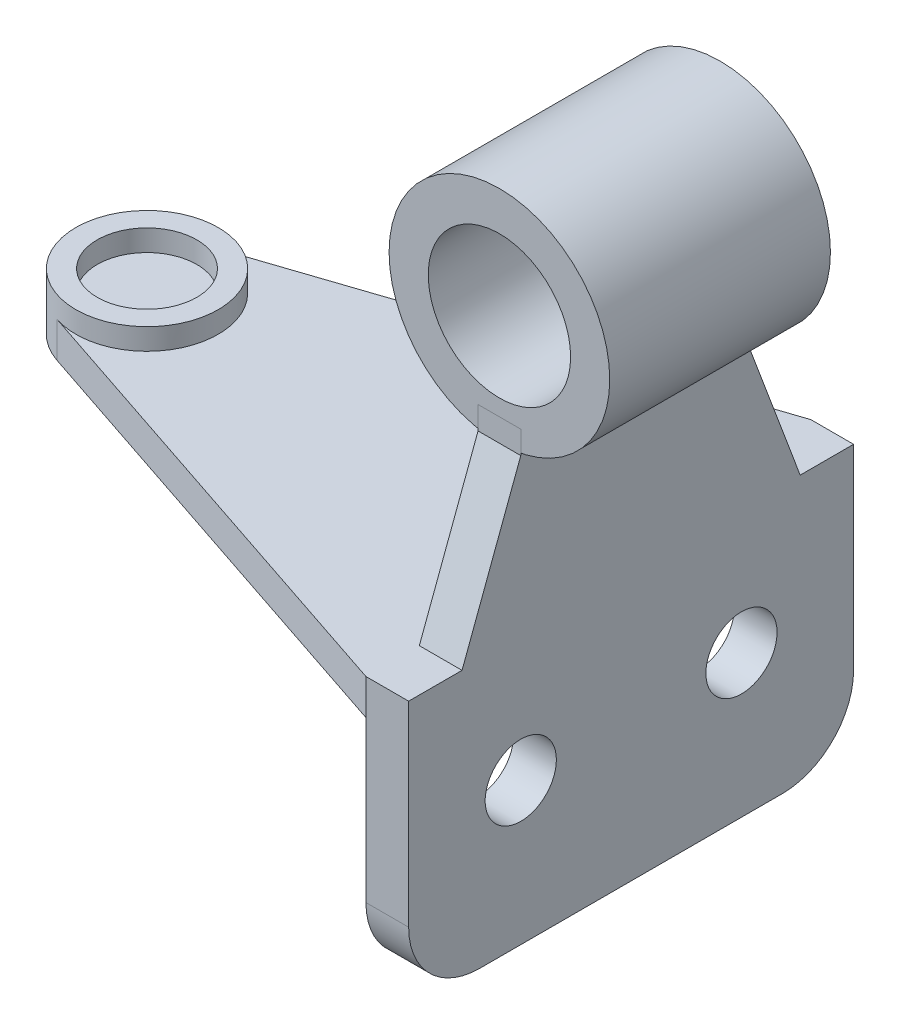
ISO-10303-21;
HEADER;
FILE_DESCRIPTION(('STEP AP214'),'2;1');
FILE_NAME('part.step','',(''),(''),'','','');
FILE_SCHEMA(('AUTOMOTIVE_DESIGN { 1 0 10303 214 1 1 1 1 }'));
ENDSEC;
DATA;
#1=APPLICATION_CONTEXT('core data for automotive mechanical design processes');
#2=APPLICATION_PROTOCOL_DEFINITION('international standard','automotive_design',2000,#1);
#3=PRODUCT_CONTEXT('',#1,'mechanical');
#4=PRODUCT('Part','Part','',(#3));
#5=PRODUCT_RELATED_PRODUCT_CATEGORY('part','',(#4));
#6=PRODUCT_DEFINITION_FORMATION('','',#4);
#7=PRODUCT_DEFINITION_CONTEXT('part definition',#1,'design');
#8=PRODUCT_DEFINITION('design','',#6,#7);
#9=PRODUCT_DEFINITION_SHAPE('','',#8);
#10=(LENGTH_UNIT() NAMED_UNIT(*) SI_UNIT(.MILLI.,.METRE.));
#11=(NAMED_UNIT(*) PLANE_ANGLE_UNIT() SI_UNIT($,.RADIAN.));
#12=(NAMED_UNIT(*) SI_UNIT($,.STERADIAN.) SOLID_ANGLE_UNIT());
#13=UNCERTAINTY_MEASURE_WITH_UNIT(LENGTH_MEASURE(1.E-05),#10,'distance_accuracy_value','');
#14=(GEOMETRIC_REPRESENTATION_CONTEXT(3) GLOBAL_UNCERTAINTY_ASSIGNED_CONTEXT((#13)) GLOBAL_UNIT_ASSIGNED_CONTEXT((#10,
#11,#12)) REPRESENTATION_CONTEXT('',''));
#15=CARTESIAN_POINT('',(0.,0.,0.));
#16=DIRECTION('',(0.,0.,1.));
#17=DIRECTION('',(1.,0.,0.));
#18=AXIS2_PLACEMENT_3D('',#15,#16,#17);
#19=CARTESIAN_POINT('',(-6.00000000000001,85.,-31.));
#20=DIRECTION('',(0.,0.,1.));
#21=DIRECTION('',(1.,0.,0.));
#22=AXIS2_PLACEMENT_3D('',#19,#20,#21);
#23=CYLINDRICAL_SURFACE('',#22,31.);
#24=CARTESIAN_POINT('',(-6.00000000000001,85.,-31.));
#25=DIRECTION('',(0.,0.,1.));
#26=DIRECTION('',(1.,0.,0.));
#27=AXIS2_PLACEMENT_3D('',#24,#25,#26);
#28=CIRCLE('',#27,31.);
#29=CARTESIAN_POINT('',(25.,85.,-31.));
#30=VERTEX_POINT('',#29);
#31=EDGE_CURVE('E11',#30,#30,#28,.T.);
#32=ORIENTED_EDGE('',*,*,#31,.T.);
#33=EDGE_LOOP('',(#32));
#34=FACE_BOUND('',#33,.T.);
#35=CARTESIAN_POINT('',(-6.00000000000001,85.,31.));
#36=DIRECTION('',(0.,0.,1.));
#37=DIRECTION('',(1.,0.,0.));
#38=AXIS2_PLACEMENT_3D('',#35,#36,#37);
#39=CIRCLE('',#38,31.);
#40=CARTESIAN_POINT('',(25.,85.,31.));
#41=VERTEX_POINT('',#40);
#42=EDGE_CURVE('E55',#41,#41,#39,.T.);
#43=ORIENTED_EDGE('',*,*,#42,.F.);
#44=EDGE_LOOP('',(#43));
#45=FACE_BOUND('',#44,.T.);
#46=ADVANCED_FACE('F45',(#34,#45),#23,.T.);
#47=CARTESIAN_POINT('',(-6.00000000000001,85.,-31.));
#48=DIRECTION('',(0.,0.,1.));
#49=DIRECTION('',(1.,0.,0.));
#50=AXIS2_PLACEMENT_3D('',#47,#48,#49);
#51=PLANE('',#50);
#52=CARTESIAN_POINT('',(-6.00000000000001,85.,-31.));
#53=DIRECTION('',(0.,0.,1.));
#54=DIRECTION('',(1.,0.,0.));
#55=AXIS2_PLACEMENT_3D('',#52,#53,#54);
#56=CIRCLE('',#55,20.);
#57=CARTESIAN_POINT('',(14.,85.,-31.));
#58=VERTEX_POINT('',#57);
#59=EDGE_CURVE('E51',#58,#58,#56,.T.);
#60=ORIENTED_EDGE('',*,*,#59,.T.);
#61=EDGE_LOOP('',(#60));
#62=FACE_BOUND('',#61,.T.);
#63=ORIENTED_EDGE('',*,*,#31,.F.);
#64=EDGE_LOOP('',(#63));
#65=FACE_BOUND('',#64,.T.);
#66=ADVANCED_FACE('F74',(#62,#65),#51,.F.);
#67=CARTESIAN_POINT('',(-6.00000000000001,85.,-31.));
#68=DIRECTION('',(0.,0.,1.));
#69=DIRECTION('',(1.,0.,0.));
#70=AXIS2_PLACEMENT_3D('',#67,#68,#69);
#71=CYLINDRICAL_SURFACE('',#70,20.);
#72=ORIENTED_EDGE('',*,*,#59,.F.);
#73=EDGE_LOOP('',(#72));
#74=FACE_BOUND('',#73,.T.);
#75=CARTESIAN_POINT('',(-6.00000000000001,85.,31.));
#76=DIRECTION('',(0.,0.,1.));
#77=DIRECTION('',(1.,0.,0.));
#78=AXIS2_PLACEMENT_3D('',#75,#76,#77);
#79=CIRCLE('',#78,20.);
#80=CARTESIAN_POINT('',(14.,85.,31.));
#81=VERTEX_POINT('',#80);
#82=EDGE_CURVE('E59',#81,#81,#79,.T.);
#83=ORIENTED_EDGE('',*,*,#82,.T.);
#84=EDGE_LOOP('',(#83));
#85=FACE_BOUND('',#84,.T.);
#86=ADVANCED_FACE('F65',(#74,#85),#71,.F.);
#87=CARTESIAN_POINT('',(-6.00000000000001,85.,31.));
#88=DIRECTION('',(0.,0.,1.));
#89=DIRECTION('',(1.,0.,0.));
#90=AXIS2_PLACEMENT_3D('',#87,#88,#89);
#91=PLANE('',#90);
#92=ORIENTED_EDGE('',*,*,#42,.T.);
#93=EDGE_LOOP('',(#92));
#94=FACE_BOUND('',#93,.T.);
#95=ORIENTED_EDGE('',*,*,#82,.F.);
#96=EDGE_LOOP('',(#95));
#97=FACE_BOUND('',#96,.T.);
#98=ADVANCED_FACE('F67',(#94,#97),#91,.T.);
#99=CLOSED_SHELL('',(#46,#66,#86,#98));
#100=MANIFOLD_SOLID_BREP('B2',#99);
#101=CARTESIAN_POINT('',(0.,10.,0.));
#102=DIRECTION('',(-1.,0.,0.));
#103=DIRECTION('',(0.,0.,1.));
#104=AXIS2_PLACEMENT_3D('',#101,#102,#103);
#105=PLANE('',#104);
#106=CARTESIAN_POINT('',(0.,-25.,31.));
#107=DIRECTION('',(1.,0.,0.));
#108=DIRECTION('',(0.,0.,-1.));
#109=AXIS2_PLACEMENT_3D('',#106,#107,#108);
#110=CIRCLE('',#109,10.);
#111=CARTESIAN_POINT('',(0.,-25.,21.));
#112=VERTEX_POINT('',#111);
#113=EDGE_CURVE('E414',#112,#112,#110,.T.);
#114=ORIENTED_EDGE('',*,*,#113,.F.);
#115=EDGE_LOOP('',(#114));
#116=FACE_BOUND('',#115,.T.);
#117=CARTESIAN_POINT('',(0.,-25.,-31.));
#118=DIRECTION('',(1.,0.,0.));
#119=DIRECTION('',(0.,0.,-1.));
#120=AXIS2_PLACEMENT_3D('',#117,#118,#119);
#121=CIRCLE('',#120,10.);
#122=CARTESIAN_POINT('',(0.,-25.,-41.));
#123=VERTEX_POINT('',#122);
#124=EDGE_CURVE('E247',#123,#123,#121,.T.);
#125=ORIENTED_EDGE('',*,*,#124,.F.);
#126=EDGE_LOOP('',(#125));
#127=FACE_BOUND('',#126,.T.);
#128=DIRECTION('',(0.,-1.,0.));
#129=VECTOR('',#128,1.);
#130=CARTESIAN_POINT('',(0.,10.,62.5000000001097));
#131=LINE('',#130,#129);
#132=CARTESIAN_POINT('',(0.,10.,62.5000000001097));
#133=VERTEX_POINT('',#132);
#134=CARTESIAN_POINT('',(0.,-45.,62.5000000001097));
#135=VERTEX_POINT('',#134);
#136=EDGE_CURVE('E331',#133,#135,#131,.T.);
#137=ORIENTED_EDGE('',*,*,#136,.T.);
#138=CARTESIAN_POINT('',(0.,-45.,42.5000000001096));
#139=DIRECTION('',(1.,0.,0.));
#140=DIRECTION('',(0.,0.,-1.));
#141=AXIS2_PLACEMENT_3D('',#138,#139,#140);
#142=CIRCLE('',#141,20.);
#143=CARTESIAN_POINT('',(0.,-65.,42.5000000001096));
#144=VERTEX_POINT('',#143);
#145=EDGE_CURVE('E219',#135,#144,#142,.T.);
#146=ORIENTED_EDGE('',*,*,#145,.T.);
#147=DIRECTION('',(0.,0.,-1.));
#148=VECTOR('',#147,1.);
#149=CARTESIAN_POINT('',(0.,-65.,-42.5000000001096));
#150=LINE('',#149,#148);
#151=CARTESIAN_POINT('',(0.,-65.,-42.5000000001096));
#152=VERTEX_POINT('',#151);
#153=EDGE_CURVE('E244',#144,#152,#150,.T.);
#154=ORIENTED_EDGE('',*,*,#153,.T.);
#155=CARTESIAN_POINT('',(0.,-45.,-42.5000000001096));
#156=DIRECTION('',(1.,0.,0.));
#157=DIRECTION('',(0.,0.,-1.));
#158=AXIS2_PLACEMENT_3D('',#155,#156,#157);
#159=CIRCLE('',#158,20.);
#160=CARTESIAN_POINT('',(0.,-45.,-62.5000000001096));
#161=VERTEX_POINT('',#160);
#162=EDGE_CURVE('E241',#152,#161,#159,.T.);
#163=ORIENTED_EDGE('',*,*,#162,.T.);
#164=DIRECTION('',(0.,-1.,0.));
#165=VECTOR('',#164,1.);
#166=CARTESIAN_POINT('',(0.,10.,-62.5000000001096));
#167=LINE('',#166,#165);
#168=CARTESIAN_POINT('',(0.,10.,-62.5000000001096));
#169=VERTEX_POINT('',#168);
#170=EDGE_CURVE('E110',#169,#161,#167,.T.);
#171=ORIENTED_EDGE('',*,*,#170,.F.);
#172=DIRECTION('',(0.,0.,-1.));
#173=VECTOR('',#172,1.);
#174=CARTESIAN_POINT('',(0.,10.,0.));
#175=LINE('',#174,#173);
#176=CARTESIAN_POINT('',(0.,10.,-47.5));
#177=VERTEX_POINT('',#176);
#178=EDGE_CURVE('E322',#177,#169,#175,.T.);
#179=ORIENTED_EDGE('',*,*,#178,.F.);
#180=DIRECTION('',(0.,0.936329177569045,0.351123441588392));
#181=VECTOR('',#180,1.);
#182=CARTESIAN_POINT('',(0.,54.,-31.));
#183=LINE('',#182,#181);
#184=CARTESIAN_POINT('',(0.,54.,-31.));
#185=VERTEX_POINT('',#184);
#186=EDGE_CURVE('E264',#177,#185,#183,.T.);
#187=ORIENTED_EDGE('',*,*,#186,.T.);
#188=DIRECTION('',(0.,1.,0.));
#189=VECTOR('',#188,1.);
#190=CARTESIAN_POINT('',(0.,54.,-31.));
#191=LINE('',#190,#189);
#192=CARTESIAN_POINT('',(0.,60.4310129353531,-31.));
#193=VERTEX_POINT('',#192);
#194=EDGE_CURVE('E288',#185,#193,#191,.T.);
#195=ORIENTED_EDGE('',*,*,#194,.T.);
#196=DIRECTION('',(0.,0.,1.));
#197=VECTOR('',#196,1.);
#198=CARTESIAN_POINT('',(0.,60.4310129353531,-31.));
#199=LINE('',#198,#197);
#200=CARTESIAN_POINT('',(0.,60.4310129353531,31.));
#201=VERTEX_POINT('',#200);
#202=EDGE_CURVE('E291',#193,#201,#199,.T.);
#203=ORIENTED_EDGE('',*,*,#202,.T.);
#204=DIRECTION('',(0.,-1.,0.));
#205=VECTOR('',#204,1.);
#206=CARTESIAN_POINT('',(0.,54.,31.));
#207=LINE('',#206,#205);
#208=CARTESIAN_POINT('',(0.,54.,31.));
#209=VERTEX_POINT('',#208);
#210=EDGE_CURVE('E294',#201,#209,#207,.T.);
#211=ORIENTED_EDGE('',*,*,#210,.T.);
#212=DIRECTION('',(0.,-0.936329177569045,0.351123441588392));
#213=VECTOR('',#212,1.);
#214=CARTESIAN_POINT('',(0.,10.,47.5));
#215=LINE('',#214,#213);
#216=CARTESIAN_POINT('',(0.,10.,47.5));
#217=VERTEX_POINT('',#216);
#218=EDGE_CURVE('E270',#209,#217,#215,.T.);
#219=ORIENTED_EDGE('',*,*,#218,.T.);
#220=EDGE_CURVE('E319',#133,#217,#175,.T.);
#221=ORIENTED_EDGE('',*,*,#220,.F.);
#222=EDGE_LOOP('',(#137,#146,#154,#163,#171,#179,#187,#195,#203,#211,#219,#221));
#223=FACE_BOUND('',#222,.T.);
#224=ADVANCED_FACE('F107',(#116,#127,#223),#105,.F.);
#225=CARTESIAN_POINT('',(0.,10.,-62.5000000001096));
#226=DIRECTION('',(0.,0.,1.));
#227=DIRECTION('',(1.,0.,0.));
#228=AXIS2_PLACEMENT_3D('',#225,#226,#227);
#229=PLANE('',#228);
#230=ORIENTED_EDGE('',*,*,#170,.T.);
#231=DIRECTION('',(1.,0.,0.));
#232=VECTOR('',#231,1.);
#233=CARTESIAN_POINT('',(-12.,-45.,-62.5000000001096));
#234=LINE('',#233,#232);
#235=CARTESIAN_POINT('',(-12.,-45.,-62.5000000001096));
#236=VERTEX_POINT('',#235);
#237=EDGE_CURVE('E261',#236,#161,#234,.T.);
#238=ORIENTED_EDGE('',*,*,#237,.F.);
#239=DIRECTION('',(0.,1.,0.));
#240=VECTOR('',#239,1.);
#241=CARTESIAN_POINT('',(-12.,0.,-62.5000000001096));
#242=LINE('',#241,#240);
#243=CARTESIAN_POINT('',(-12.,0.,-62.5000000001096));
#244=VERTEX_POINT('',#243);
#245=EDGE_CURVE('E254',#236,#244,#242,.T.);
#246=ORIENTED_EDGE('',*,*,#245,.T.);
#247=DIRECTION('',(0.,-1.,0.));
#248=VECTOR('',#247,1.);
#249=CARTESIAN_POINT('',(-12.0000000000366,10.,-62.5000000001097));
#250=LINE('',#249,#248);
#251=CARTESIAN_POINT('',(-12.0000000000366,10.,-62.5000000001097));
#252=VERTEX_POINT('',#251);
#253=EDGE_CURVE('E345',#252,#244,#250,.T.);
#254=ORIENTED_EDGE('',*,*,#253,.F.);
#255=DIRECTION('',(-1.,0.,0.));
#256=VECTOR('',#255,1.);
#257=CARTESIAN_POINT('',(0.,10.,-62.5000000001096));
#258=LINE('',#257,#256);
#259=EDGE_CURVE('E321',#169,#252,#258,.T.);
#260=ORIENTED_EDGE('',*,*,#259,.F.);
#261=EDGE_LOOP('',(#230,#238,#246,#254,#260));
#262=FACE_BOUND('',#261,.T.);
#263=ADVANCED_FACE('F354',(#262),#229,.F.);
#264=CARTESIAN_POINT('',(-12.0000000000366,10.,-62.5000000001097));
#265=DIRECTION('',(0.316783244820079,0.,0.948497957721187));
#266=DIRECTION('',(0.948497957721187,0.,-0.316783244820079));
#267=AXIS2_PLACEMENT_3D('',#264,#265,#266);
#268=PLANE('',#267);
#269=DIRECTION('',(-0.948497957721187,0.,0.316783244820079));
#270=VECTOR('',#269,1.);
#271=CARTESIAN_POINT('',(-12.0000000000366,0.,-62.5000000001097));
#272=LINE('',#271,#270);
#273=CARTESIAN_POINT('',(-142.335664896402,0.,-18.9699591544237));
#274=VERTEX_POINT('',#273);
#275=EDGE_CURVE('E317',#244,#274,#272,.T.);
#276=ORIENTED_EDGE('',*,*,#275,.T.);
#277=DIRECTION('',(0.,-1.,0.));
#278=VECTOR('',#277,1.);
#279=CARTESIAN_POINT('',(-142.335664896402,10.,-18.9699591544237));
#280=LINE('',#279,#278);
#281=CARTESIAN_POINT('',(-142.335664896402,10.,-18.9699591544237));
#282=VERTEX_POINT('',#281);
#283=EDGE_CURVE('E343',#282,#274,#280,.T.);
#284=ORIENTED_EDGE('',*,*,#283,.F.);
#285=DIRECTION('',(-0.948497957721187,0.,0.316783244820079));
#286=VECTOR('',#285,1.);
#287=CARTESIAN_POINT('',(-12.0000000000366,10.,-62.5000000001097));
#288=LINE('',#287,#286);
#289=EDGE_CURVE('E324',#252,#282,#288,.T.);
#290=ORIENTED_EDGE('',*,*,#289,.F.);
#291=ORIENTED_EDGE('',*,*,#253,.T.);
#292=EDGE_LOOP('',(#276,#284,#290,#291));
#293=FACE_BOUND('',#292,.T.);
#294=ADVANCED_FACE('F363',(#293),#268,.F.);
#295=CARTESIAN_POINT('',(-136.,10.,0.));
#296=DIRECTION('',(0.,-1.,0.));
#297=DIRECTION('',(0.,0.,-1.));
#298=AXIS2_PLACEMENT_3D('',#295,#296,#297);
#299=CYLINDRICAL_SURFACE('',#298,20.);
#300=CARTESIAN_POINT('',(-136.,0.,0.));
#301=DIRECTION('',(0.,1.,0.));
#302=DIRECTION('',(0.,0.,1.));
#303=AXIS2_PLACEMENT_3D('',#300,#301,#302);
#304=CIRCLE('',#303,20.);
#305=CARTESIAN_POINT('',(-142.335664896402,0.,18.9699591544238));
#306=VERTEX_POINT('',#305);
#307=EDGE_CURVE('E333',#274,#306,#304,.T.);
#308=ORIENTED_EDGE('',*,*,#307,.T.);
#309=DIRECTION('',(0.,-1.,0.));
#310=VECTOR('',#309,1.);
#311=CARTESIAN_POINT('',(-142.335664896402,10.,18.9699591544238));
#312=LINE('',#311,#310);
#313=CARTESIAN_POINT('',(-142.335664896402,10.,18.9699591544238));
#314=VERTEX_POINT('',#313);
#315=EDGE_CURVE('E340',#314,#306,#312,.T.);
#316=ORIENTED_EDGE('',*,*,#315,.F.);
#317=CARTESIAN_POINT('',(-136.,10.,0.));
#318=DIRECTION('',(0.,1.,0.));
#319=DIRECTION('',(0.,0.,1.));
#320=AXIS2_PLACEMENT_3D('',#317,#318,#319);
#321=CIRCLE('',#320,20.);
#322=EDGE_CURVE('E43',#314,#282,#321,.T.);
#323=ORIENTED_EDGE('',*,*,#322,.T.);
#324=ORIENTED_EDGE('',*,*,#283,.T.);
#325=EDGE_LOOP('',(#308,#316,#323,#324));
#326=FACE_BOUND('',#325,.T.);
#327=CARTESIAN_POINT('',(-136.,16.,0.));
#328=DIRECTION('',(0.,1.,0.));
#329=DIRECTION('',(0.,0.,1.));
#330=AXIS2_PLACEMENT_3D('',#327,#328,#329);
#331=CIRCLE('',#330,20.);
#332=CARTESIAN_POINT('',(-136.,16.,20.));
#333=VERTEX_POINT('',#332);
#334=EDGE_CURVE('E313',#333,#333,#331,.T.);
#335=ORIENTED_EDGE('',*,*,#334,.F.);
#336=EDGE_LOOP('',(#335));
#337=FACE_BOUND('',#336,.T.);
#338=ADVANCED_FACE('F367',(#326,#337),#299,.T.);
#339=CARTESIAN_POINT('',(-12.0000000000366,10.,62.5000000001097));
#340=DIRECTION('',(0.316783244820079,0.,-0.948497957721187));
#341=DIRECTION('',(-0.948497957721187,0.,-0.316783244820079));
#342=AXIS2_PLACEMENT_3D('',#339,#340,#341);
#343=PLANE('',#342);
#344=DIRECTION('',(0.948497957721187,0.,0.316783244820079));
#345=VECTOR('',#344,1.);
#346=CARTESIAN_POINT('',(-12.0000000000366,0.,62.5000000001097));
#347=LINE('',#346,#345);
#348=CARTESIAN_POINT('',(-12.0000000000366,0.,62.5000000001097));
#349=VERTEX_POINT('',#348);
#350=EDGE_CURVE('E335',#306,#349,#347,.T.);
#351=ORIENTED_EDGE('',*,*,#350,.T.);
#352=DIRECTION('',(0.,-1.,0.));
#353=VECTOR('',#352,1.);
#354=CARTESIAN_POINT('',(-12.0000000000366,10.,62.5000000001097));
#355=LINE('',#354,#353);
#356=CARTESIAN_POINT('',(-12.0000000000366,10.,62.5000000001097));
#357=VERTEX_POINT('',#356);
#358=EDGE_CURVE('E240',#357,#349,#355,.T.);
#359=ORIENTED_EDGE('',*,*,#358,.F.);
#360=DIRECTION('',(0.948497957721187,0.,0.316783244820079));
#361=VECTOR('',#360,1.);
#362=CARTESIAN_POINT('',(-12.0000000000366,10.,62.5000000001097));
#363=LINE('',#362,#361);
#364=EDGE_CURVE('E327',#314,#357,#363,.T.);
#365=ORIENTED_EDGE('',*,*,#364,.F.);
#366=ORIENTED_EDGE('',*,*,#315,.T.);
#367=EDGE_LOOP('',(#351,#359,#365,#366));
#368=FACE_BOUND('',#367,.T.);
#369=ADVANCED_FACE('F373',(#368),#343,.F.);
#370=CARTESIAN_POINT('',(0.,10.,62.5000000001097));
#371=DIRECTION('',(0.,0.,-1.));
#372=DIRECTION('',(-1.,0.,0.));
#373=AXIS2_PLACEMENT_3D('',#370,#371,#372);
#374=PLANE('',#373);
#375=ORIENTED_EDGE('',*,*,#358,.T.);
#376=DIRECTION('',(0.,-1.,0.));
#377=VECTOR('',#376,1.);
#378=CARTESIAN_POINT('',(-12.,-45.,62.5000000001096));
#379=LINE('',#378,#377);
#380=CARTESIAN_POINT('',(-12.,-45.,62.5000000001097));
#381=VERTEX_POINT('',#380);
#382=EDGE_CURVE('E230',#349,#381,#379,.T.);
#383=ORIENTED_EDGE('',*,*,#382,.T.);
#384=DIRECTION('',(1.,0.,0.));
#385=VECTOR('',#384,1.);
#386=CARTESIAN_POINT('',(-12.,-45.,62.5000000001097));
#387=LINE('',#386,#385);
#388=EDGE_CURVE('E214',#381,#135,#387,.T.);
#389=ORIENTED_EDGE('',*,*,#388,.T.);
#390=ORIENTED_EDGE('',*,*,#136,.F.);
#391=DIRECTION('',(1.,0.,0.));
#392=VECTOR('',#391,1.);
#393=CARTESIAN_POINT('',(0.,10.,62.5000000001097));
#394=LINE('',#393,#392);
#395=EDGE_CURVE('E329',#357,#133,#394,.T.);
#396=ORIENTED_EDGE('',*,*,#395,.F.);
#397=EDGE_LOOP('',(#375,#383,#389,#390,#396));
#398=FACE_BOUND('',#397,.T.);
#399=ADVANCED_FACE('F237',(#398),#374,.F.);
#400=CARTESIAN_POINT('',(-136.,10.,0.));
#401=DIRECTION('',(0.,1.,0.));
#402=DIRECTION('',(0.,0.,1.));
#403=AXIS2_PLACEMENT_3D('',#400,#401,#402);
#404=PLANE('',#403);
#405=DIRECTION('',(1.,0.,0.));
#406=VECTOR('',#405,1.);
#407=CARTESIAN_POINT('',(-12.,10.,47.5));
#408=LINE('',#407,#406);
#409=CARTESIAN_POINT('',(-12.,10.,47.5));
#410=VERTEX_POINT('',#409);
#411=EDGE_CURVE('E127',#410,#217,#408,.T.);
#412=ORIENTED_EDGE('',*,*,#411,.F.);
#413=DIRECTION('',(0.,0.,-1.));
#414=VECTOR('',#413,1.);
#415=CARTESIAN_POINT('',(-12.,10.,47.5));
#416=LINE('',#415,#414);
#417=CARTESIAN_POINT('',(-12.,10.,-47.5));
#418=VERTEX_POINT('',#417);
#419=EDGE_CURVE('E122',#410,#418,#416,.T.);
#420=ORIENTED_EDGE('',*,*,#419,.T.);
#421=DIRECTION('',(1.,0.,0.));
#422=VECTOR('',#421,1.);
#423=CARTESIAN_POINT('',(-12.,10.,-47.5));
#424=LINE('',#423,#422);
#425=EDGE_CURVE('E285',#418,#177,#424,.T.);
#426=ORIENTED_EDGE('',*,*,#425,.T.);
#427=ORIENTED_EDGE('',*,*,#178,.T.);
#428=ORIENTED_EDGE('',*,*,#259,.T.);
#429=ORIENTED_EDGE('',*,*,#289,.T.);
#430=ORIENTED_EDGE('',*,*,#322,.F.);
#431=ORIENTED_EDGE('',*,*,#364,.T.);
#432=ORIENTED_EDGE('',*,*,#395,.T.);
#433=ORIENTED_EDGE('',*,*,#220,.T.);
#434=EDGE_LOOP('',(#412,#420,#426,#427,#428,#429,#430,#431,#432,#433));
#435=FACE_BOUND('',#434,.T.);
#436=ADVANCED_FACE('F364',(#435),#404,.T.);
#437=CARTESIAN_POINT('',(-136.,0.,0.));
#438=DIRECTION('',(0.,1.,0.));
#439=DIRECTION('',(0.,0.,1.));
#440=AXIS2_PLACEMENT_3D('',#437,#438,#439);
#441=PLANE('',#440);
#442=ORIENTED_EDGE('',*,*,#275,.F.);
#443=DIRECTION('',(0.,0.,1.));
#444=VECTOR('',#443,1.);
#445=CARTESIAN_POINT('',(-12.,0.,62.5000000001097));
#446=LINE('',#445,#444);
#447=EDGE_CURVE('E224',#244,#349,#446,.T.);
#448=ORIENTED_EDGE('',*,*,#447,.T.);
#449=ORIENTED_EDGE('',*,*,#350,.F.);
#450=ORIENTED_EDGE('',*,*,#307,.F.);
#451=EDGE_LOOP('',(#442,#448,#449,#450));
#452=FACE_BOUND('',#451,.T.);
#453=ADVANCED_FACE('F464',(#452),#441,.F.);
#454=CARTESIAN_POINT('',(-136.,16.,0.));
#455=DIRECTION('',(0.,1.,0.));
#456=DIRECTION('',(0.,0.,1.));
#457=AXIS2_PLACEMENT_3D('',#454,#455,#456);
#458=PLANE('',#457);
#459=ORIENTED_EDGE('',*,*,#334,.T.);
#460=EDGE_LOOP('',(#459));
#461=FACE_BOUND('',#460,.T.);
#462=CARTESIAN_POINT('',(-136.,16.,0.));
#463=DIRECTION('',(0.,1.,0.));
#464=DIRECTION('',(0.,0.,1.));
#465=AXIS2_PLACEMENT_3D('',#462,#463,#464);
#466=CIRCLE('',#465,14.);
#467=CARTESIAN_POINT('',(-136.,16.,14.));
#468=VERTEX_POINT('',#467);
#469=EDGE_CURVE('E310',#468,#468,#466,.T.);
#470=ORIENTED_EDGE('',*,*,#469,.F.);
#471=EDGE_LOOP('',(#470));
#472=FACE_BOUND('',#471,.T.);
#473=ADVANCED_FACE('F460',(#461,#472),#458,.T.);
#474=CARTESIAN_POINT('',(-136.,16.,0.));
#475=DIRECTION('',(0.,-1.,0.));
#476=DIRECTION('',(0.,0.,-1.));
#477=AXIS2_PLACEMENT_3D('',#474,#475,#476);
#478=CYLINDRICAL_SURFACE('',#477,14.);
#479=ORIENTED_EDGE('',*,*,#469,.T.);
#480=EDGE_LOOP('',(#479));
#481=FACE_BOUND('',#480,.T.);
#482=CARTESIAN_POINT('',(-136.,10.,0.));
#483=DIRECTION('',(0.,1.,0.));
#484=DIRECTION('',(0.,0.,1.));
#485=AXIS2_PLACEMENT_3D('',#482,#483,#484);
#486=CIRCLE('',#485,14.);
#487=CARTESIAN_POINT('',(-136.,10.,14.));
#488=VERTEX_POINT('',#487);
#489=EDGE_CURVE('E300',#488,#488,#486,.T.);
#490=ORIENTED_EDGE('',*,*,#489,.F.);
#491=EDGE_LOOP('',(#490));
#492=FACE_BOUND('',#491,.T.);
#493=ADVANCED_FACE('F457',(#481,#492),#478,.F.);
#494=ORIENTED_EDGE('',*,*,#489,.T.);
#495=EDGE_LOOP('',(#494));
#496=FACE_BOUND('',#495,.T.);
#497=ADVANCED_FACE('F404',(#496),#404,.T.);
#498=CARTESIAN_POINT('',(-12.,10.,47.5));
#499=DIRECTION('',(0.,0.351123441588392,0.936329177569044));
#500=DIRECTION('',(0.,-0.936329177569045,0.351123441588392));
#501=AXIS2_PLACEMENT_3D('',#498,#499,#500);
#502=PLANE('',#501);
#503=ORIENTED_EDGE('',*,*,#218,.F.);
#504=DIRECTION('',(1.,0.,0.));
#505=VECTOR('',#504,1.);
#506=CARTESIAN_POINT('',(-12.,54.,31.));
#507=LINE('',#506,#505);
#508=CARTESIAN_POINT('',(-12.,54.,31.));
#509=VERTEX_POINT('',#508);
#510=EDGE_CURVE('E301',#509,#209,#507,.T.);
#511=ORIENTED_EDGE('',*,*,#510,.F.);
#512=DIRECTION('',(0.,-0.936329177569045,0.351123441588392));
#513=VECTOR('',#512,1.);
#514=CARTESIAN_POINT('',(-12.,10.,47.5));
#515=LINE('',#514,#513);
#516=EDGE_CURVE('E282',#509,#410,#515,.T.);
#517=ORIENTED_EDGE('',*,*,#516,.T.);
#518=ORIENTED_EDGE('',*,*,#411,.T.);
#519=EDGE_LOOP('',(#503,#511,#517,#518));
#520=FACE_BOUND('',#519,.T.);
#521=ADVANCED_FACE('F378',(#520),#502,.T.);
#522=CARTESIAN_POINT('',(-12.,54.,31.));
#523=DIRECTION('',(0.,0.,1.));
#524=DIRECTION('',(1.,0.,0.));
#525=AXIS2_PLACEMENT_3D('',#522,#523,#524);
#526=PLANE('',#525);
#527=ORIENTED_EDGE('',*,*,#210,.F.);
#528=DIRECTION('',(1.,0.,0.));
#529=VECTOR('',#528,1.);
#530=CARTESIAN_POINT('',(-12.,60.4310129353531,31.));
#531=LINE('',#530,#529);
#532=CARTESIAN_POINT('',(-12.,60.4310129353531,31.));
#533=VERTEX_POINT('',#532);
#534=EDGE_CURVE('E303',#533,#201,#531,.T.);
#535=ORIENTED_EDGE('',*,*,#534,.F.);
#536=DIRECTION('',(0.,-1.,0.));
#537=VECTOR('',#536,1.);
#538=CARTESIAN_POINT('',(-12.,54.,31.));
#539=LINE('',#538,#537);
#540=EDGE_CURVE('E279',#533,#509,#539,.T.);
#541=ORIENTED_EDGE('',*,*,#540,.T.);
#542=ORIENTED_EDGE('',*,*,#510,.T.);
#543=EDGE_LOOP('',(#527,#535,#541,#542));
#544=FACE_BOUND('',#543,.T.);
#545=ADVANCED_FACE('F396',(#544),#526,.T.);
#546=CARTESIAN_POINT('',(-12.,60.4310129353531,-31.));
#547=DIRECTION('',(0.,1.,0.));
#548=DIRECTION('',(0.,0.,1.));
#549=AXIS2_PLACEMENT_3D('',#546,#547,#548);
#550=PLANE('',#549);
#551=ORIENTED_EDGE('',*,*,#202,.F.);
#552=DIRECTION('',(1.,0.,0.));
#553=VECTOR('',#552,1.);
#554=CARTESIAN_POINT('',(-12.,60.4310129353531,-31.));
#555=LINE('',#554,#553);
#556=CARTESIAN_POINT('',(-12.,60.4310129353531,-31.));
#557=VERTEX_POINT('',#556);
#558=EDGE_CURVE('E305',#557,#193,#555,.T.);
#559=ORIENTED_EDGE('',*,*,#558,.F.);
#560=DIRECTION('',(0.,0.,1.));
#561=VECTOR('',#560,1.);
#562=CARTESIAN_POINT('',(-12.,60.4310129353531,-31.));
#563=LINE('',#562,#561);
#564=EDGE_CURVE('E276',#557,#533,#563,.T.);
#565=ORIENTED_EDGE('',*,*,#564,.T.);
#566=ORIENTED_EDGE('',*,*,#534,.T.);
#567=EDGE_LOOP('',(#551,#559,#565,#566));
#568=FACE_BOUND('',#567,.T.);
#569=ADVANCED_FACE('F394',(#568),#550,.T.);
#570=CARTESIAN_POINT('',(-12.,54.,-31.));
#571=DIRECTION('',(0.,0.,-1.));
#572=DIRECTION('',(-1.,0.,0.));
#573=AXIS2_PLACEMENT_3D('',#570,#571,#572);
#574=PLANE('',#573);
#575=ORIENTED_EDGE('',*,*,#194,.F.);
#576=DIRECTION('',(1.,0.,0.));
#577=VECTOR('',#576,1.);
#578=CARTESIAN_POINT('',(-12.,54.,-31.));
#579=LINE('',#578,#577);
#580=CARTESIAN_POINT('',(-12.,54.,-31.));
#581=VERTEX_POINT('',#580);
#582=EDGE_CURVE('E307',#581,#185,#579,.T.);
#583=ORIENTED_EDGE('',*,*,#582,.F.);
#584=DIRECTION('',(0.,1.,0.));
#585=VECTOR('',#584,1.);
#586=CARTESIAN_POINT('',(-12.,54.,-31.));
#587=LINE('',#586,#585);
#588=EDGE_CURVE('E273',#581,#557,#587,.T.);
#589=ORIENTED_EDGE('',*,*,#588,.T.);
#590=ORIENTED_EDGE('',*,*,#558,.T.);
#591=EDGE_LOOP('',(#575,#583,#589,#590));
#592=FACE_BOUND('',#591,.T.);
#593=ADVANCED_FACE('F392',(#592),#574,.T.);
#594=CARTESIAN_POINT('',(-12.,54.,-31.));
#595=DIRECTION('',(0.,0.351123441588392,-0.936329177569044));
#596=DIRECTION('',(0.,0.936329177569045,0.351123441588392));
#597=AXIS2_PLACEMENT_3D('',#594,#595,#596);
#598=PLANE('',#597);
#599=ORIENTED_EDGE('',*,*,#186,.F.);
#600=ORIENTED_EDGE('',*,*,#425,.F.);
#601=DIRECTION('',(0.,0.936329177569045,0.351123441588392));
#602=VECTOR('',#601,1.);
#603=CARTESIAN_POINT('',(-12.,54.,-31.));
#604=LINE('',#603,#602);
#605=EDGE_CURVE('E269',#418,#581,#604,.T.);
#606=ORIENTED_EDGE('',*,*,#605,.T.);
#607=ORIENTED_EDGE('',*,*,#582,.T.);
#608=EDGE_LOOP('',(#599,#600,#606,#607));
#609=FACE_BOUND('',#608,.T.);
#610=ADVANCED_FACE('F388',(#609),#598,.T.);
#611=CARTESIAN_POINT('',(-12.,0.,0.));
#612=DIRECTION('',(1.,0.,0.));
#613=DIRECTION('',(0.,0.,-1.));
#614=AXIS2_PLACEMENT_3D('',#611,#612,#613);
#615=PLANE('',#614);
#616=ORIENTED_EDGE('',*,*,#419,.F.);
#617=ORIENTED_EDGE('',*,*,#516,.F.);
#618=ORIENTED_EDGE('',*,*,#540,.F.);
#619=ORIENTED_EDGE('',*,*,#564,.F.);
#620=ORIENTED_EDGE('',*,*,#588,.F.);
#621=ORIENTED_EDGE('',*,*,#605,.F.);
#622=EDGE_LOOP('',(#616,#617,#618,#619,#620,#621));
#623=FACE_BOUND('',#622,.T.);
#624=ADVANCED_FACE('F382',(#623),#615,.F.);
#625=CARTESIAN_POINT('',(-12.,-45.,-42.5000000001096));
#626=DIRECTION('',(1.,0.,0.));
#627=DIRECTION('',(0.,0.,-1.));
#628=AXIS2_PLACEMENT_3D('',#625,#626,#627);
#629=CYLINDRICAL_SURFACE('',#628,20.);
#630=ORIENTED_EDGE('',*,*,#162,.F.);
#631=DIRECTION('',(1.,0.,0.));
#632=VECTOR('',#631,1.);
#633=CARTESIAN_POINT('',(-12.,-65.,-42.5000000001096));
#634=LINE('',#633,#632);
#635=CARTESIAN_POINT('',(-12.,-65.,-42.5000000001096));
#636=VERTEX_POINT('',#635);
#637=EDGE_CURVE('E265',#636,#152,#634,.T.);
#638=ORIENTED_EDGE('',*,*,#637,.F.);
#639=CARTESIAN_POINT('',(-12.,-45.,-42.5000000001096));
#640=DIRECTION('',(1.,0.,0.));
#641=DIRECTION('',(0.,0.,-1.));
#642=AXIS2_PLACEMENT_3D('',#639,#640,#641);
#643=CIRCLE('',#642,20.);
#644=EDGE_CURVE('E251',#636,#236,#643,.T.);
#645=ORIENTED_EDGE('',*,*,#644,.T.);
#646=ORIENTED_EDGE('',*,*,#237,.T.);
#647=EDGE_LOOP('',(#630,#638,#645,#646));
#648=FACE_BOUND('',#647,.T.);
#649=ADVANCED_FACE('F359',(#648),#629,.T.);
#650=CARTESIAN_POINT('',(-12.,-65.,-42.5000000001096));
#651=DIRECTION('',(0.,-1.,0.));
#652=DIRECTION('',(0.,0.,-1.));
#653=AXIS2_PLACEMENT_3D('',#650,#651,#652);
#654=PLANE('',#653);
#655=ORIENTED_EDGE('',*,*,#153,.F.);
#656=DIRECTION('',(1.,0.,0.));
#657=VECTOR('',#656,1.);
#658=CARTESIAN_POINT('',(-12.,-65.,42.5000000001096));
#659=LINE('',#658,#657);
#660=CARTESIAN_POINT('',(-12.,-65.,42.5000000001096));
#661=VERTEX_POINT('',#660);
#662=EDGE_CURVE('E223',#661,#144,#659,.T.);
#663=ORIENTED_EDGE('',*,*,#662,.F.);
#664=DIRECTION('',(0.,0.,-1.));
#665=VECTOR('',#664,1.);
#666=CARTESIAN_POINT('',(-12.,-65.,-42.5000000001096));
#667=LINE('',#666,#665);
#668=EDGE_CURVE('E234',#661,#636,#667,.T.);
#669=ORIENTED_EDGE('',*,*,#668,.T.);
#670=ORIENTED_EDGE('',*,*,#637,.T.);
#671=EDGE_LOOP('',(#655,#663,#669,#670));
#672=FACE_BOUND('',#671,.T.);
#673=ADVANCED_FACE('F362',(#672),#654,.T.);
#674=CARTESIAN_POINT('',(-12.,-45.,42.5000000001096));
#675=DIRECTION('',(1.,0.,0.));
#676=DIRECTION('',(0.,0.,-1.));
#677=AXIS2_PLACEMENT_3D('',#674,#675,#676);
#678=CYLINDRICAL_SURFACE('',#677,20.);
#679=ORIENTED_EDGE('',*,*,#145,.F.);
#680=ORIENTED_EDGE('',*,*,#388,.F.);
#681=CARTESIAN_POINT('',(-12.,-45.,42.5000000001096));
#682=DIRECTION('',(1.,0.,0.));
#683=DIRECTION('',(0.,0.,-1.));
#684=AXIS2_PLACEMENT_3D('',#681,#682,#683);
#685=CIRCLE('',#684,20.);
#686=EDGE_CURVE('E217',#381,#661,#685,.T.);
#687=ORIENTED_EDGE('',*,*,#686,.T.);
#688=ORIENTED_EDGE('',*,*,#662,.T.);
#689=EDGE_LOOP('',(#679,#680,#687,#688));
#690=FACE_BOUND('',#689,.T.);
#691=ADVANCED_FACE('F216',(#690),#678,.T.);
#692=CARTESIAN_POINT('',(-12.,-45.,-42.5000000001096));
#693=DIRECTION('',(1.,0.,0.));
#694=DIRECTION('',(0.,0.,-1.));
#695=AXIS2_PLACEMENT_3D('',#692,#693,#694);
#696=PLANE('',#695);
#697=CARTESIAN_POINT('',(-12.,-25.,31.));
#698=DIRECTION('',(1.,0.,0.));
#699=DIRECTION('',(0.,0.,-1.));
#700=AXIS2_PLACEMENT_3D('',#697,#698,#699);
#701=CIRCLE('',#700,10.);
#702=CARTESIAN_POINT('',(-12.,-25.,21.));
#703=VERTEX_POINT('',#702);
#704=EDGE_CURVE('E258',#703,#703,#701,.T.);
#705=ORIENTED_EDGE('',*,*,#704,.T.);
#706=EDGE_LOOP('',(#705));
#707=FACE_BOUND('',#706,.T.);
#708=CARTESIAN_POINT('',(-12.,-25.,-31.));
#709=DIRECTION('',(1.,0.,0.));
#710=DIRECTION('',(0.,0.,-1.));
#711=AXIS2_PLACEMENT_3D('',#708,#709,#710);
#712=CIRCLE('',#711,10.);
#713=CARTESIAN_POINT('',(-12.,-25.,-41.));
#714=VERTEX_POINT('',#713);
#715=EDGE_CURVE('E418',#714,#714,#712,.T.);
#716=ORIENTED_EDGE('',*,*,#715,.T.);
#717=EDGE_LOOP('',(#716));
#718=FACE_BOUND('',#717,.T.);
#719=ORIENTED_EDGE('',*,*,#382,.F.);
#720=ORIENTED_EDGE('',*,*,#447,.F.);
#721=ORIENTED_EDGE('',*,*,#245,.F.);
#722=ORIENTED_EDGE('',*,*,#644,.F.);
#723=ORIENTED_EDGE('',*,*,#668,.F.);
#724=ORIENTED_EDGE('',*,*,#686,.F.);
#725=EDGE_LOOP('',(#719,#720,#721,#722,#723,#724));
#726=FACE_BOUND('',#725,.T.);
#727=ADVANCED_FACE('F228',(#707,#718,#726),#696,.F.);
#728=CARTESIAN_POINT('',(-12.,-25.,-31.));
#729=DIRECTION('',(1.,0.,0.));
#730=DIRECTION('',(0.,0.,-1.));
#731=AXIS2_PLACEMENT_3D('',#728,#729,#730);
#732=CYLINDRICAL_SURFACE('',#731,10.);
#733=ORIENTED_EDGE('',*,*,#715,.F.);
#734=EDGE_LOOP('',(#733));
#735=FACE_BOUND('',#734,.T.);
#736=ORIENTED_EDGE('',*,*,#124,.T.);
#737=EDGE_LOOP('',(#736));
#738=FACE_BOUND('',#737,.T.);
#739=ADVANCED_FACE('F431',(#735,#738),#732,.F.);
#740=CARTESIAN_POINT('',(-12.,-25.,31.));
#741=DIRECTION('',(1.,0.,0.));
#742=DIRECTION('',(0.,0.,-1.));
#743=AXIS2_PLACEMENT_3D('',#740,#741,#742);
#744=CYLINDRICAL_SURFACE('',#743,10.);
#745=ORIENTED_EDGE('',*,*,#704,.F.);
#746=EDGE_LOOP('',(#745));
#747=FACE_BOUND('',#746,.T.);
#748=ORIENTED_EDGE('',*,*,#113,.T.);
#749=EDGE_LOOP('',(#748));
#750=FACE_BOUND('',#749,.T.);
#751=ADVANCED_FACE('F428',(#747,#750),#744,.F.);
#752=CLOSED_SHELL('',(#224,#263,#294,#338,#369,#399,#436,#453,#473,#493,#497,#521,#545,#569,
#593,#610,#624,#649,#673,#691,#727,#739,#751));
#753=MANIFOLD_SOLID_BREP('B6',#752);
#754=ADVANCED_BREP_SHAPE_REPRESENTATION('',(#18,#100,#753),#14);
#755=SHAPE_DEFINITION_REPRESENTATION(#9,#754);
ENDSEC;
END-ISO-10303-21;
